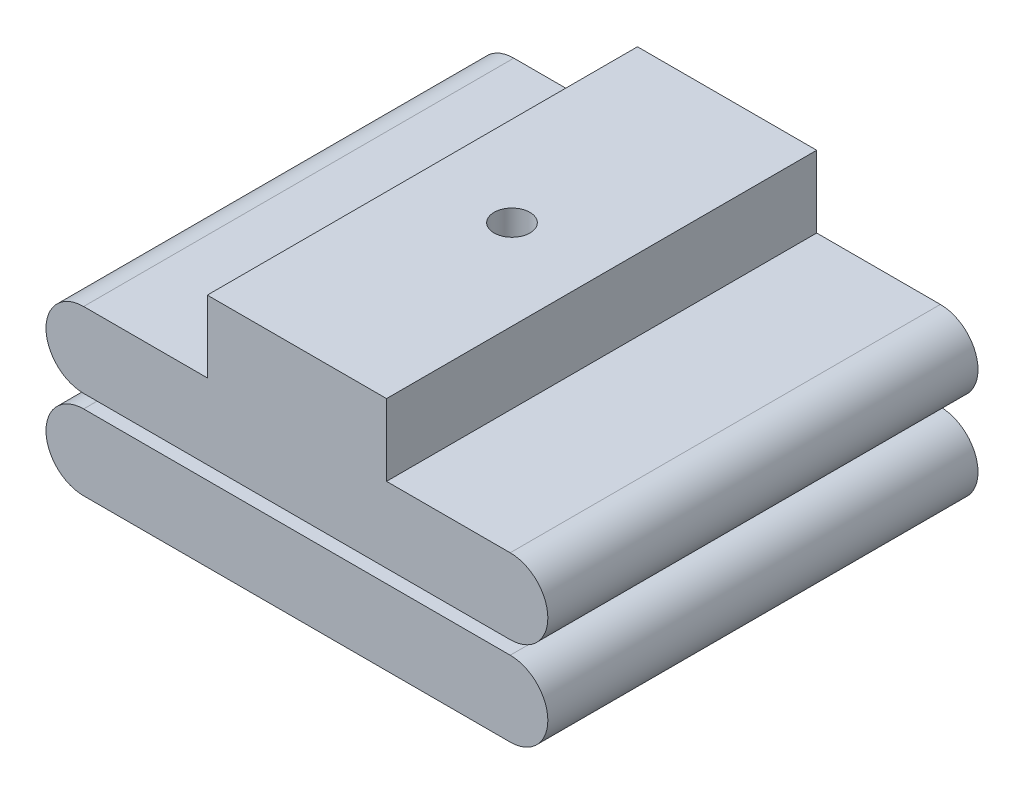
ISO-10303-21;
HEADER;
FILE_DESCRIPTION(('STEP AP214'),'2;1');
FILE_NAME('part.step','',(''),(''),'','','');
FILE_SCHEMA(('AUTOMOTIVE_DESIGN { 1 0 10303 214 1 1 1 1 }'));
ENDSEC;
DATA;
#1=APPLICATION_CONTEXT('core data for automotive mechanical design processes');
#2=APPLICATION_PROTOCOL_DEFINITION('international standard','automotive_design',2000,#1);
#3=PRODUCT_CONTEXT('',#1,'mechanical');
#4=PRODUCT('Part','Part','',(#3));
#5=PRODUCT_RELATED_PRODUCT_CATEGORY('part','',(#4));
#6=PRODUCT_DEFINITION_FORMATION('','',#4);
#7=PRODUCT_DEFINITION_CONTEXT('part definition',#1,'design');
#8=PRODUCT_DEFINITION('design','',#6,#7);
#9=PRODUCT_DEFINITION_SHAPE('','',#8);
#10=(LENGTH_UNIT() NAMED_UNIT(*) SI_UNIT(.MILLI.,.METRE.));
#11=(NAMED_UNIT(*) PLANE_ANGLE_UNIT() SI_UNIT($,.RADIAN.));
#12=(NAMED_UNIT(*) SI_UNIT($,.STERADIAN.) SOLID_ANGLE_UNIT());
#13=UNCERTAINTY_MEASURE_WITH_UNIT(LENGTH_MEASURE(1.E-05),#10,'distance_accuracy_value','');
#14=(GEOMETRIC_REPRESENTATION_CONTEXT(3) GLOBAL_UNCERTAINTY_ASSIGNED_CONTEXT((#13)) GLOBAL_UNIT_ASSIGNED_CONTEXT((#10,
#11,#12)) REPRESENTATION_CONTEXT('',''));
#15=CARTESIAN_POINT('',(0.,0.,0.));
#16=DIRECTION('',(0.,0.,1.));
#17=DIRECTION('',(1.,0.,0.));
#18=AXIS2_PLACEMENT_3D('',#15,#16,#17);
#19=CARTESIAN_POINT('',(11.9,-2.09999999999999,10.));
#20=DIRECTION('',(-1.,0.,0.));
#21=DIRECTION('',(0.,-1.,0.));
#22=AXIS2_PLACEMENT_3D('',#19,#20,#21);
#23=SPHERICAL_SURFACE('',#22,0.5);
#24=CARTESIAN_POINT('',(11.9,-2.1,10.));
#25=DIRECTION('',(-1.,0.,0.));
#26=DIRECTION('',(0.,-1.,0.));
#27=AXIS2_PLACEMENT_3D('',#24,#25,#26);
#28=CIRCLE('',#27,0.499999999999997);
#29=CARTESIAN_POINT('',(11.9,-2.59999999999999,10.));
#30=VERTEX_POINT('',#29);
#31=CARTESIAN_POINT('',(11.9,-1.6,10.));
#32=VERTEX_POINT('',#31);
#33=EDGE_CURVE('E381',#30,#32,#28,.T.);
#34=ORIENTED_EDGE('',*,*,#33,.T.);
#35=CARTESIAN_POINT('',(11.9,-2.1,10.));
#36=DIRECTION('',(0.,0.,1.));
#37=DIRECTION('',(-1.,0.,0.));
#38=AXIS2_PLACEMENT_3D('',#35,#36,#37);
#39=CIRCLE('',#38,0.5);
#40=EDGE_CURVE('E398',#30,#32,#39,.T.);
#41=ORIENTED_EDGE('',*,*,#40,.F.);
#42=EDGE_LOOP('',(#34,#41));
#43=FACE_BOUND('',#42,.T.);
#44=ADVANCED_FACE('F58',(#43),#23,.F.);
#45=CARTESIAN_POINT('',(-12.4,-2.1,10.));
#46=DIRECTION('',(-1.,0.,0.));
#47=DIRECTION('',(0.,-1.,0.));
#48=AXIS2_PLACEMENT_3D('',#45,#46,#47);
#49=CYLINDRICAL_SURFACE('',#48,0.499999999999999);
#50=CARTESIAN_POINT('',(-11.9,-2.1,10.));
#51=DIRECTION('',(-1.,0.,0.));
#52=DIRECTION('',(0.,-1.,0.));
#53=AXIS2_PLACEMENT_3D('',#50,#51,#52);
#54=CIRCLE('',#53,0.5);
#55=CARTESIAN_POINT('',(-11.9,-2.6,10.));
#56=VERTEX_POINT('',#55);
#57=CARTESIAN_POINT('',(-11.9,-1.6,10.));
#58=VERTEX_POINT('',#57);
#59=EDGE_CURVE('E377',#56,#58,#54,.T.);
#60=ORIENTED_EDGE('',*,*,#59,.T.);
#61=DIRECTION('',(-1.,0.,0.));
#62=VECTOR('',#61,1.);
#63=CARTESIAN_POINT('',(-11.9,-1.6,10.));
#64=LINE('',#63,#62);
#65=EDGE_CURVE('E402',#32,#58,#64,.T.);
#66=ORIENTED_EDGE('',*,*,#65,.F.);
#67=ORIENTED_EDGE('',*,*,#33,.F.);
#68=DIRECTION('',(1.,0.,0.));
#69=VECTOR('',#68,1.);
#70=CARTESIAN_POINT('',(-11.9,-2.6,10.));
#71=LINE('',#70,#69);
#72=EDGE_CURVE('E410',#56,#30,#71,.T.);
#73=ORIENTED_EDGE('',*,*,#72,.F.);
#74=EDGE_LOOP('',(#60,#66,#67,#73));
#75=FACE_BOUND('',#74,.T.);
#76=ADVANCED_FACE('F480',(#75),#49,.F.);
#77=CARTESIAN_POINT('',(-11.9,-2.1,10.));
#78=DIRECTION('',(-1.,0.,0.));
#79=DIRECTION('',(0.,-1.,0.));
#80=AXIS2_PLACEMENT_3D('',#77,#78,#79);
#81=SPHERICAL_SURFACE('',#80,0.5);
#82=CARTESIAN_POINT('',(-11.9,-2.1,10.));
#83=DIRECTION('',(0.,0.,1.));
#84=DIRECTION('',(1.,0.,0.));
#85=AXIS2_PLACEMENT_3D('',#82,#83,#84);
#86=CIRCLE('',#85,0.5);
#87=EDGE_CURVE('E406',#58,#56,#86,.T.);
#88=ORIENTED_EDGE('',*,*,#87,.F.);
#89=ORIENTED_EDGE('',*,*,#59,.F.);
#90=EDGE_LOOP('',(#88,#89));
#91=FACE_BOUND('',#90,.T.);
#92=ADVANCED_FACE('F486',(#91),#81,.F.);
#93=CARTESIAN_POINT('',(-11.9,-2.1,10.));
#94=DIRECTION('',(0.,0.,-1.));
#95=DIRECTION('',(-1.,0.,0.));
#96=AXIS2_PLACEMENT_3D('',#93,#94,#95);
#97=CYLINDRICAL_SURFACE('',#96,0.5);
#98=DIRECTION('',(0.,0.,-1.));
#99=VECTOR('',#98,1.);
#100=CARTESIAN_POINT('',(-11.9,-2.6,10.));
#101=LINE('',#100,#99);
#102=CARTESIAN_POINT('',(-11.9,-2.6,-10.));
#103=VERTEX_POINT('',#102);
#104=EDGE_CURVE('E418',#56,#103,#101,.T.);
#105=ORIENTED_EDGE('',*,*,#104,.T.);
#106=CARTESIAN_POINT('',(-11.9,-2.1,-10.));
#107=DIRECTION('',(0.,0.,1.));
#108=DIRECTION('',(1.,0.,0.));
#109=AXIS2_PLACEMENT_3D('',#106,#107,#108);
#110=CIRCLE('',#109,0.5);
#111=CARTESIAN_POINT('',(-11.9,-1.6,-10.));
#112=VERTEX_POINT('',#111);
#113=EDGE_CURVE('E370',#112,#103,#110,.T.);
#114=ORIENTED_EDGE('',*,*,#113,.F.);
#115=DIRECTION('',(0.,0.,-1.));
#116=VECTOR('',#115,1.);
#117=CARTESIAN_POINT('',(-11.9,-1.6,10.));
#118=LINE('',#117,#116);
#119=EDGE_CURVE('E422',#58,#112,#118,.T.);
#120=ORIENTED_EDGE('',*,*,#119,.F.);
#121=ORIENTED_EDGE('',*,*,#87,.T.);
#122=EDGE_LOOP('',(#105,#114,#120,#121));
#123=FACE_BOUND('',#122,.T.);
#124=ADVANCED_FACE('F501',(#123),#97,.F.);
#125=CARTESIAN_POINT('',(-11.9,-1.6,10.));
#126=DIRECTION('',(0.,-1.,0.));
#127=DIRECTION('',(0.,0.,-1.));
#128=AXIS2_PLACEMENT_3D('',#125,#126,#127);
#129=PLANE('',#128);
#130=CARTESIAN_POINT('',(0.,-1.6,0.));
#131=DIRECTION('',(0.,-1.,0.));
#132=DIRECTION('',(0.,0.,-1.));
#133=AXIS2_PLACEMENT_3D('',#130,#131,#132);
#134=CIRCLE('',#133,2.);
#135=CARTESIAN_POINT('',(0.,-1.6,-2.));
#136=VERTEX_POINT('',#135);
#137=EDGE_CURVE('E13',#136,#136,#134,.F.);
#138=ORIENTED_EDGE('',*,*,#137,.T.);
#139=EDGE_LOOP('',(#138));
#140=FACE_BOUND('',#139,.T.);
#141=ORIENTED_EDGE('',*,*,#119,.T.);
#142=DIRECTION('',(-1.,0.,0.));
#143=VECTOR('',#142,1.);
#144=CARTESIAN_POINT('',(-11.9,-1.6,-10.));
#145=LINE('',#144,#143);
#146=CARTESIAN_POINT('',(11.9,-1.6,-10.));
#147=VERTEX_POINT('',#146);
#148=EDGE_CURVE('E374',#147,#112,#145,.T.);
#149=ORIENTED_EDGE('',*,*,#148,.F.);
#150=DIRECTION('',(0.,0.,-1.));
#151=VECTOR('',#150,1.);
#152=CARTESIAN_POINT('',(11.9,-1.6,10.));
#153=LINE('',#152,#151);
#154=EDGE_CURVE('E426',#32,#147,#153,.T.);
#155=ORIENTED_EDGE('',*,*,#154,.F.);
#156=ORIENTED_EDGE('',*,*,#65,.T.);
#157=EDGE_LOOP('',(#141,#149,#155,#156));
#158=FACE_BOUND('',#157,.T.);
#159=ADVANCED_FACE('F504',(#140,#158),#129,.T.);
#160=CARTESIAN_POINT('',(11.9,-2.1,10.));
#161=DIRECTION('',(0.,0.,-1.));
#162=DIRECTION('',(-1.,0.,0.));
#163=AXIS2_PLACEMENT_3D('',#160,#161,#162);
#164=CYLINDRICAL_SURFACE('',#163,0.5);
#165=ORIENTED_EDGE('',*,*,#154,.T.);
#166=CARTESIAN_POINT('',(11.9,-2.1,-10.));
#167=DIRECTION('',(0.,0.,1.));
#168=DIRECTION('',(-1.,0.,0.));
#169=AXIS2_PLACEMENT_3D('',#166,#167,#168);
#170=CIRCLE('',#169,0.5);
#171=CARTESIAN_POINT('',(11.9,-2.59999999999999,-10.));
#172=VERTEX_POINT('',#171);
#173=EDGE_CURVE('E364',#172,#147,#170,.T.);
#174=ORIENTED_EDGE('',*,*,#173,.F.);
#175=DIRECTION('',(0.,0.,-1.));
#176=VECTOR('',#175,1.);
#177=CARTESIAN_POINT('',(11.9,-2.6,10.));
#178=LINE('',#177,#176);
#179=EDGE_CURVE('E414',#30,#172,#178,.T.);
#180=ORIENTED_EDGE('',*,*,#179,.F.);
#181=ORIENTED_EDGE('',*,*,#40,.T.);
#182=EDGE_LOOP('',(#165,#174,#180,#181));
#183=FACE_BOUND('',#182,.T.);
#184=ADVANCED_FACE('F499',(#183),#164,.F.);
#185=CARTESIAN_POINT('',(-11.9,-2.6,10.));
#186=DIRECTION('',(0.,1.,0.));
#187=DIRECTION('',(0.,0.,1.));
#188=AXIS2_PLACEMENT_3D('',#185,#186,#187);
#189=PLANE('',#188);
#190=CARTESIAN_POINT('',(0.,-2.6,0.));
#191=DIRECTION('',(0.,1.,0.));
#192=DIRECTION('',(0.,0.,1.));
#193=AXIS2_PLACEMENT_3D('',#190,#191,#192);
#194=CIRCLE('',#193,2.00000000000015);
#195=CARTESIAN_POINT('',(0.,-2.6,2.00000000000015));
#196=VERTEX_POINT('',#195);
#197=EDGE_CURVE('E459',#196,#196,#194,.F.);
#198=ORIENTED_EDGE('',*,*,#197,.T.);
#199=EDGE_LOOP('',(#198));
#200=FACE_BOUND('',#199,.T.);
#201=ORIENTED_EDGE('',*,*,#179,.T.);
#202=DIRECTION('',(1.,0.,0.));
#203=VECTOR('',#202,1.);
#204=CARTESIAN_POINT('',(-11.9,-2.6,-10.));
#205=LINE('',#204,#203);
#206=EDGE_CURVE('E367',#103,#172,#205,.T.);
#207=ORIENTED_EDGE('',*,*,#206,.F.);
#208=ORIENTED_EDGE('',*,*,#104,.F.);
#209=ORIENTED_EDGE('',*,*,#72,.T.);
#210=EDGE_LOOP('',(#201,#207,#208,#209));
#211=FACE_BOUND('',#210,.T.);
#212=ADVANCED_FACE('F495',(#200,#211),#189,.T.);
#213=CARTESIAN_POINT('',(11.9,-2.09999999999999,-10.));
#214=DIRECTION('',(-1.,0.,0.));
#215=DIRECTION('',(0.,-1.,0.));
#216=AXIS2_PLACEMENT_3D('',#213,#214,#215);
#217=SPHERICAL_SURFACE('',#216,0.5);
#218=CARTESIAN_POINT('',(11.9,-2.1,-10.));
#219=DIRECTION('',(1.,0.,0.));
#220=DIRECTION('',(0.,-1.,0.));
#221=AXIS2_PLACEMENT_3D('',#218,#219,#220);
#222=CIRCLE('',#221,0.499999999999997);
#223=EDGE_CURVE('E344',#172,#147,#222,.T.);
#224=ORIENTED_EDGE('',*,*,#223,.F.);
#225=ORIENTED_EDGE('',*,*,#173,.T.);
#226=EDGE_LOOP('',(#224,#225));
#227=FACE_BOUND('',#226,.T.);
#228=ADVANCED_FACE('F498',(#227),#217,.F.);
#229=CARTESIAN_POINT('',(-12.4,-2.1,-10.));
#230=DIRECTION('',(-1.,0.,0.));
#231=DIRECTION('',(0.,-1.,0.));
#232=AXIS2_PLACEMENT_3D('',#229,#230,#231);
#233=CYLINDRICAL_SURFACE('',#232,0.499999999999999);
#234=CARTESIAN_POINT('',(-11.9,-2.1,-10.));
#235=DIRECTION('',(1.,0.,0.));
#236=DIRECTION('',(0.,-1.,0.));
#237=AXIS2_PLACEMENT_3D('',#234,#235,#236);
#238=CIRCLE('',#237,0.5);
#239=EDGE_CURVE('E340',#103,#112,#238,.T.);
#240=ORIENTED_EDGE('',*,*,#239,.F.);
#241=ORIENTED_EDGE('',*,*,#206,.T.);
#242=ORIENTED_EDGE('',*,*,#223,.T.);
#243=ORIENTED_EDGE('',*,*,#148,.T.);
#244=EDGE_LOOP('',(#240,#241,#242,#243));
#245=FACE_BOUND('',#244,.T.);
#246=ADVANCED_FACE('F557',(#245),#233,.F.);
#247=CARTESIAN_POINT('',(-11.9,-2.1,-10.));
#248=DIRECTION('',(-1.,0.,0.));
#249=DIRECTION('',(0.,-1.,0.));
#250=AXIS2_PLACEMENT_3D('',#247,#248,#249);
#251=SPHERICAL_SURFACE('',#250,0.5);
#252=ORIENTED_EDGE('',*,*,#113,.T.);
#253=ORIENTED_EDGE('',*,*,#239,.T.);
#254=EDGE_LOOP('',(#252,#253));
#255=FACE_BOUND('',#254,.T.);
#256=ADVANCED_FACE('F550',(#255),#251,.F.);
#257=CARTESIAN_POINT('',(0.,-10.3784271247462,0.));
#258=DIRECTION('',(0.,1.,0.));
#259=DIRECTION('',(-1.,0.,0.));
#260=AXIS2_PLACEMENT_3D('',#257,#258,#259);
#261=CYLINDRICAL_SURFACE('',#260,1.);
#262=CARTESIAN_POINT('',(0.,-0.600000000000002,0.));
#263=DIRECTION('',(0.,-1.,0.));
#264=DIRECTION('',(0.,0.,-1.));
#265=AXIS2_PLACEMENT_3D('',#262,#263,#264);
#266=CIRCLE('',#265,1.);
#267=CARTESIAN_POINT('',(-1.,-0.6,0.));
#268=VERTEX_POINT('',#267);
#269=EDGE_CURVE('E67',#268,#268,#266,.T.);
#270=CARTESIAN_POINT('',(0.,4.,0.));
#271=DIRECTION('',(0.,1.,0.));
#272=DIRECTION('',(-1.,0.,0.));
#273=AXIS2_PLACEMENT_3D('',#270,#271,#272);
#274=CIRCLE('',#273,1.);
#275=CARTESIAN_POINT('',(-1.,4.,0.));
#276=VERTEX_POINT('',#275);
#277=EDGE_CURVE('E1101',#276,#276,#274,.T.);
#278=CARTESIAN_POINT('',(-1.,-0.6,0.));
#279=CARTESIAN_POINT('',(-1.,-0.552083333333333,0.));
#280=CARTESIAN_POINT('',(-1.,-0.504166666666667,0.));
#281=CARTESIAN_POINT('',(-1.,-0.408333333333333,0.));
#282=CARTESIAN_POINT('',(-1.,-0.360416666666667,0.));
#283=CARTESIAN_POINT('',(-1.,-0.264583333333334,0.));
#284=CARTESIAN_POINT('',(-1.,-0.216666666666667,0.));
#285=CARTESIAN_POINT('',(-1.,-0.120833333333334,0.));
#286=CARTESIAN_POINT('',(-1.,-0.0729166666666673,0.));
#287=CARTESIAN_POINT('',(-1.,0.0229166666666665,0.));
#288=CARTESIAN_POINT('',(-1.,0.0708333333333336,0.));
#289=CARTESIAN_POINT('',(-1.,0.166666666666667,0.));
#290=CARTESIAN_POINT('',(-1.,0.214583333333334,0.));
#291=CARTESIAN_POINT('',(-1.,0.310416666666667,0.));
#292=CARTESIAN_POINT('',(-1.,0.358333333333334,0.));
#293=CARTESIAN_POINT('',(-1.,0.454166666666667,0.));
#294=CARTESIAN_POINT('',(-1.,0.502083333333334,0.));
#295=CARTESIAN_POINT('',(-1.,0.597916666666667,0.));
#296=CARTESIAN_POINT('',(-1.,0.645833333333333,0.));
#297=CARTESIAN_POINT('',(-1.,0.741666666666666,0.));
#298=CARTESIAN_POINT('',(-1.,0.789583333333333,0.));
#299=CARTESIAN_POINT('',(-1.,0.885416666666666,0.));
#300=CARTESIAN_POINT('',(-1.,0.933333333333333,0.));
#301=CARTESIAN_POINT('',(-1.,1.02916666666667,0.));
#302=CARTESIAN_POINT('',(-1.,1.07708333333333,0.));
#303=CARTESIAN_POINT('',(-1.,1.17291666666667,0.));
#304=CARTESIAN_POINT('',(-1.,1.22083333333333,0.));
#305=CARTESIAN_POINT('',(-1.,1.31666666666667,0.));
#306=CARTESIAN_POINT('',(-1.,1.36458333333333,0.));
#307=CARTESIAN_POINT('',(-1.,1.46041666666667,0.));
#308=CARTESIAN_POINT('',(-1.,1.50833333333333,0.));
#309=CARTESIAN_POINT('',(-1.,1.60416666666667,0.));
#310=CARTESIAN_POINT('',(-1.,1.65208333333333,0.));
#311=CARTESIAN_POINT('',(-1.,1.74791666666667,0.));
#312=CARTESIAN_POINT('',(-1.,1.79583333333333,0.));
#313=CARTESIAN_POINT('',(-1.,1.89166666666667,0.));
#314=CARTESIAN_POINT('',(-1.,1.93958333333333,0.));
#315=CARTESIAN_POINT('',(-1.,2.03541666666667,0.));
#316=CARTESIAN_POINT('',(-1.,2.08333333333333,0.));
#317=CARTESIAN_POINT('',(-1.,2.17916666666667,0.));
#318=CARTESIAN_POINT('',(-1.,2.22708333333333,0.));
#319=CARTESIAN_POINT('',(-1.,2.32291666666667,0.));
#320=CARTESIAN_POINT('',(-1.,2.37083333333333,0.));
#321=CARTESIAN_POINT('',(-1.,2.46666666666667,0.));
#322=CARTESIAN_POINT('',(-1.,2.51458333333333,0.));
#323=CARTESIAN_POINT('',(-1.,2.61041666666667,0.));
#324=CARTESIAN_POINT('',(-1.,2.65833333333333,0.));
#325=CARTESIAN_POINT('',(-1.,2.75416666666667,0.));
#326=CARTESIAN_POINT('',(-1.,2.80208333333333,0.));
#327=CARTESIAN_POINT('',(-1.,2.89791666666667,0.));
#328=CARTESIAN_POINT('',(-1.,2.94583333333333,0.));
#329=CARTESIAN_POINT('',(-1.,3.04166666666667,0.));
#330=CARTESIAN_POINT('',(-1.,3.08958333333333,0.));
#331=CARTESIAN_POINT('',(-1.,3.18541666666667,0.));
#332=CARTESIAN_POINT('',(-1.,3.23333333333333,0.));
#333=CARTESIAN_POINT('',(-1.,3.32916666666667,0.));
#334=CARTESIAN_POINT('',(-1.,3.37708333333333,0.));
#335=CARTESIAN_POINT('',(-1.,3.47291666666667,0.));
#336=CARTESIAN_POINT('',(-1.,3.52083333333333,0.));
#337=CARTESIAN_POINT('',(-1.,3.61666666666667,0.));
#338=CARTESIAN_POINT('',(-1.,3.66458333333333,0.));
#339=CARTESIAN_POINT('',(-1.,3.76041666666667,0.));
#340=CARTESIAN_POINT('',(-1.,3.80833333333333,0.));
#341=CARTESIAN_POINT('',(-1.,3.90416666666667,0.));
#342=CARTESIAN_POINT('',(-1.,3.95208333333333,0.));
#343=CARTESIAN_POINT('',(-1.,4.,0.));
#344=B_SPLINE_CURVE_WITH_KNOTS('',3,(#278,#279,#280,#281,#282,#283,#284,#285,#286,#287,#288,
#289,#290,#291,#292,#293,#294,#295,#296,#297,#298,#299,#300,#301,#302,#303,#304,#305,#306,#307,
#308,#309,#310,#311,#312,#313,#314,#315,#316,#317,#318,#319,#320,#321,#322,#323,#324,#325,#326,
#327,#328,#329,#330,#331,#332,#333,#334,#335,#336,#337,#338,#339,#340,#341,#342,#343),
.UNSPECIFIED.,.F.,.F.,(4,2,2,2,2,2,2,2,2,2,2,2,2,2,2,2,2,2,2,2,2,2,2,2,2,2,2,2,2,2,2,2,4),(0.,
0.14375,0.2875,0.431249999999999,0.574999999999999,0.718750000000001,0.8625,1.00625,1.15,
1.29375,1.4375,1.58125,1.725,1.86875,2.0125,2.15625,2.3,2.44375,2.5875,2.73125,2.875,3.01875,
3.1625,3.30625,3.45,3.59375,3.7375,3.88125,4.025,4.16875,4.3125,4.45625,4.6),.UNSPECIFIED.);
#345=EDGE_CURVE('BSEAM467',#268,#276,#344,.T.);
#346=ORIENTED_EDGE('',*,*,#269,.T.);
#347=ORIENTED_EDGE('',*,*,#277,.T.);
#348=ORIENTED_EDGE('',*,*,#345,.T.);
#349=ORIENTED_EDGE('',*,*,#345,.F.);
#350=EDGE_LOOP('',(#346,#348,#347,#349));
#351=FACE_BOUND('',#350,.T.);
#352=ADVANCED_FACE('F467',(#351),#261,.F.);
#353=CARTESIAN_POINT('',(0.,0.,0.));
#354=DIRECTION('',(0.,1.,0.));
#355=DIRECTION('',(0.,0.,1.));
#356=AXIS2_PLACEMENT_3D('',#353,#354,#355);
#357=CYLINDRICAL_SURFACE('',#356,1.00000000000015);
#358=CARTESIAN_POINT('',(0.,-5.55,0.));
#359=DIRECTION('',(0.,-1.,0.));
#360=DIRECTION('',(0.,0.,-1.));
#361=AXIS2_PLACEMENT_3D('',#358,#359,#360);
#362=CIRCLE('',#361,1.00000000000015);
#363=CARTESIAN_POINT('',(0.,-5.55,-1.00000000000015));
#364=VERTEX_POINT('',#363);
#365=EDGE_CURVE('E451',#364,#364,#362,.T.);
#366=ORIENTED_EDGE('',*,*,#365,.T.);
#367=EDGE_LOOP('',(#366));
#368=FACE_BOUND('',#367,.T.);
#369=CARTESIAN_POINT('',(0.,-3.6,0.));
#370=DIRECTION('',(0.,1.,0.));
#371=DIRECTION('',(0.,0.,1.));
#372=AXIS2_PLACEMENT_3D('',#369,#370,#371);
#373=CIRCLE('',#372,1.00000000000015);
#374=CARTESIAN_POINT('',(0.,-3.6,1.00000000000015));
#375=VERTEX_POINT('',#374);
#376=EDGE_CURVE('E447',#375,#375,#373,.T.);
#377=ORIENTED_EDGE('',*,*,#376,.T.);
#378=EDGE_LOOP('',(#377));
#379=FACE_BOUND('',#378,.T.);
#380=ADVANCED_FACE('F536',(#368,#379),#357,.F.);
#381=CARTESIAN_POINT('',(11.9,-7.04999999999999,10.));
#382=DIRECTION('',(-1.,0.,0.));
#383=DIRECTION('',(0.,-1.,0.));
#384=AXIS2_PLACEMENT_3D('',#381,#382,#383);
#385=SPHERICAL_SURFACE('',#384,0.5);
#386=CARTESIAN_POINT('',(11.9,-7.05,10.));
#387=DIRECTION('',(-1.,0.,0.));
#388=DIRECTION('',(0.,-1.,0.));
#389=AXIS2_PLACEMENT_3D('',#386,#387,#388);
#390=CIRCLE('',#389,0.499999999999997);
#391=CARTESIAN_POINT('',(11.9,-7.55,10.));
#392=VERTEX_POINT('',#391);
#393=CARTESIAN_POINT('',(11.9,-6.55,10.));
#394=VERTEX_POINT('',#393);
#395=EDGE_CURVE('E273',#392,#394,#390,.T.);
#396=ORIENTED_EDGE('',*,*,#395,.T.);
#397=CARTESIAN_POINT('',(11.9,-7.05,10.));
#398=DIRECTION('',(0.,0.,1.));
#399=DIRECTION('',(-1.,0.,0.));
#400=AXIS2_PLACEMENT_3D('',#397,#398,#399);
#401=CIRCLE('',#400,0.5);
#402=EDGE_CURVE('E292',#392,#394,#401,.T.);
#403=ORIENTED_EDGE('',*,*,#402,.F.);
#404=EDGE_LOOP('',(#396,#403));
#405=FACE_BOUND('',#404,.T.);
#406=ADVANCED_FACE('F539',(#405),#385,.F.);
#407=CARTESIAN_POINT('',(-12.4,-7.05,10.));
#408=DIRECTION('',(-1.,0.,0.));
#409=DIRECTION('',(0.,-1.,0.));
#410=AXIS2_PLACEMENT_3D('',#407,#408,#409);
#411=CYLINDRICAL_SURFACE('',#410,0.499999999999999);
#412=CARTESIAN_POINT('',(-11.9,-7.05,10.));
#413=DIRECTION('',(-1.,0.,0.));
#414=DIRECTION('',(0.,-1.,0.));
#415=AXIS2_PLACEMENT_3D('',#412,#413,#414);
#416=CIRCLE('',#415,0.5);
#417=CARTESIAN_POINT('',(-11.9,-7.55,10.));
#418=VERTEX_POINT('',#417);
#419=CARTESIAN_POINT('',(-11.9,-6.55,10.));
#420=VERTEX_POINT('',#419);
#421=EDGE_CURVE('E269',#418,#420,#416,.T.);
#422=ORIENTED_EDGE('',*,*,#421,.T.);
#423=DIRECTION('',(-1.,0.,0.));
#424=VECTOR('',#423,1.);
#425=CARTESIAN_POINT('',(-11.9,-6.55,10.));
#426=LINE('',#425,#424);
#427=EDGE_CURVE('E296',#394,#420,#426,.T.);
#428=ORIENTED_EDGE('',*,*,#427,.F.);
#429=ORIENTED_EDGE('',*,*,#395,.F.);
#430=DIRECTION('',(1.,0.,0.));
#431=VECTOR('',#430,1.);
#432=CARTESIAN_POINT('',(-11.9,-7.55,10.));
#433=LINE('',#432,#431);
#434=EDGE_CURVE('E304',#418,#392,#433,.T.);
#435=ORIENTED_EDGE('',*,*,#434,.F.);
#436=EDGE_LOOP('',(#422,#428,#429,#435));
#437=FACE_BOUND('',#436,.T.);
#438=ADVANCED_FACE('F547',(#437),#411,.F.);
#439=CARTESIAN_POINT('',(-11.9,-7.05,10.));
#440=DIRECTION('',(-1.,0.,0.));
#441=DIRECTION('',(0.,-1.,0.));
#442=AXIS2_PLACEMENT_3D('',#439,#440,#441);
#443=SPHERICAL_SURFACE('',#442,0.5);
#444=CARTESIAN_POINT('',(-11.9,-7.05,10.));
#445=DIRECTION('',(0.,0.,1.));
#446=DIRECTION('',(1.,0.,0.));
#447=AXIS2_PLACEMENT_3D('',#444,#445,#446);
#448=CIRCLE('',#447,0.5);
#449=EDGE_CURVE('E300',#420,#418,#448,.T.);
#450=ORIENTED_EDGE('',*,*,#449,.F.);
#451=ORIENTED_EDGE('',*,*,#421,.F.);
#452=EDGE_LOOP('',(#450,#451));
#453=FACE_BOUND('',#452,.T.);
#454=ADVANCED_FACE('F768',(#453),#443,.F.);
#455=CARTESIAN_POINT('',(-11.9,-7.05,10.));
#456=DIRECTION('',(0.,0.,-1.));
#457=DIRECTION('',(-1.,0.,0.));
#458=AXIS2_PLACEMENT_3D('',#455,#456,#457);
#459=CYLINDRICAL_SURFACE('',#458,0.5);
#460=DIRECTION('',(0.,0.,-1.));
#461=VECTOR('',#460,1.);
#462=CARTESIAN_POINT('',(-11.9,-7.55,10.));
#463=LINE('',#462,#461);
#464=CARTESIAN_POINT('',(-11.9,-7.55,-10.));
#465=VERTEX_POINT('',#464);
#466=EDGE_CURVE('E312',#418,#465,#463,.T.);
#467=ORIENTED_EDGE('',*,*,#466,.T.);
#468=CARTESIAN_POINT('',(-11.9,-7.05,-10.));
#469=DIRECTION('',(0.,0.,1.));
#470=DIRECTION('',(1.,0.,0.));
#471=AXIS2_PLACEMENT_3D('',#468,#469,#470);
#472=CIRCLE('',#471,0.5);
#473=CARTESIAN_POINT('',(-11.9,-6.55,-10.));
#474=VERTEX_POINT('',#473);
#475=EDGE_CURVE('E262',#474,#465,#472,.T.);
#476=ORIENTED_EDGE('',*,*,#475,.F.);
#477=DIRECTION('',(0.,0.,-1.));
#478=VECTOR('',#477,1.);
#479=CARTESIAN_POINT('',(-11.9,-6.55,10.));
#480=LINE('',#479,#478);
#481=EDGE_CURVE('E316',#420,#474,#480,.T.);
#482=ORIENTED_EDGE('',*,*,#481,.F.);
#483=ORIENTED_EDGE('',*,*,#449,.T.);
#484=EDGE_LOOP('',(#467,#476,#482,#483));
#485=FACE_BOUND('',#484,.T.);
#486=ADVANCED_FACE('F642',(#485),#459,.F.);
#487=CARTESIAN_POINT('',(-11.9,-6.55,10.));
#488=DIRECTION('',(0.,-1.,0.));
#489=DIRECTION('',(0.,0.,-1.));
#490=AXIS2_PLACEMENT_3D('',#487,#488,#489);
#491=PLANE('',#490);
#492=CARTESIAN_POINT('',(0.,-6.55,0.));
#493=DIRECTION('',(0.,-1.,0.));
#494=DIRECTION('',(0.,0.,-1.));
#495=AXIS2_PLACEMENT_3D('',#492,#493,#494);
#496=CIRCLE('',#495,2.00000000000015);
#497=CARTESIAN_POINT('',(0.,-6.55,-2.00000000000015));
#498=VERTEX_POINT('',#497);
#499=EDGE_CURVE('E455',#498,#498,#496,.F.);
#500=ORIENTED_EDGE('',*,*,#499,.T.);
#501=EDGE_LOOP('',(#500));
#502=FACE_BOUND('',#501,.T.);
#503=ORIENTED_EDGE('',*,*,#481,.T.);
#504=DIRECTION('',(-1.,0.,0.));
#505=VECTOR('',#504,1.);
#506=CARTESIAN_POINT('',(-11.9,-6.55,-10.));
#507=LINE('',#506,#505);
#508=CARTESIAN_POINT('',(11.9,-6.55,-10.));
#509=VERTEX_POINT('',#508);
#510=EDGE_CURVE('E266',#509,#474,#507,.T.);
#511=ORIENTED_EDGE('',*,*,#510,.F.);
#512=DIRECTION('',(0.,0.,-1.));
#513=VECTOR('',#512,1.);
#514=CARTESIAN_POINT('',(11.9,-6.55,10.));
#515=LINE('',#514,#513);
#516=EDGE_CURVE('E320',#394,#509,#515,.T.);
#517=ORIENTED_EDGE('',*,*,#516,.F.);
#518=ORIENTED_EDGE('',*,*,#427,.T.);
#519=EDGE_LOOP('',(#503,#511,#517,#518));
#520=FACE_BOUND('',#519,.T.);
#521=ADVANCED_FACE('F637',(#502,#520),#491,.T.);
#522=CARTESIAN_POINT('',(11.9,-7.05,10.));
#523=DIRECTION('',(0.,0.,-1.));
#524=DIRECTION('',(-1.,0.,0.));
#525=AXIS2_PLACEMENT_3D('',#522,#523,#524);
#526=CYLINDRICAL_SURFACE('',#525,0.5);
#527=ORIENTED_EDGE('',*,*,#516,.T.);
#528=CARTESIAN_POINT('',(11.9,-7.05,-10.));
#529=DIRECTION('',(0.,0.,1.));
#530=DIRECTION('',(-1.,0.,0.));
#531=AXIS2_PLACEMENT_3D('',#528,#529,#530);
#532=CIRCLE('',#531,0.5);
#533=CARTESIAN_POINT('',(11.9,-7.55,-10.));
#534=VERTEX_POINT('',#533);
#535=EDGE_CURVE('E256',#534,#509,#532,.T.);
#536=ORIENTED_EDGE('',*,*,#535,.F.);
#537=DIRECTION('',(0.,0.,-1.));
#538=VECTOR('',#537,1.);
#539=CARTESIAN_POINT('',(11.9,-7.55,10.));
#540=LINE('',#539,#538);
#541=EDGE_CURVE('E308',#392,#534,#540,.T.);
#542=ORIENTED_EDGE('',*,*,#541,.F.);
#543=ORIENTED_EDGE('',*,*,#402,.T.);
#544=EDGE_LOOP('',(#527,#536,#542,#543));
#545=FACE_BOUND('',#544,.T.);
#546=ADVANCED_FACE('F641',(#545),#526,.F.);
#547=CARTESIAN_POINT('',(-11.9,-7.55,10.));
#548=DIRECTION('',(0.,1.,0.));
#549=DIRECTION('',(0.,0.,1.));
#550=AXIS2_PLACEMENT_3D('',#547,#548,#549);
#551=PLANE('',#550);
#552=ORIENTED_EDGE('',*,*,#541,.T.);
#553=DIRECTION('',(1.,0.,0.));
#554=VECTOR('',#553,1.);
#555=CARTESIAN_POINT('',(-11.9,-7.55,-10.));
#556=LINE('',#555,#554);
#557=EDGE_CURVE('E259',#465,#534,#556,.T.);
#558=ORIENTED_EDGE('',*,*,#557,.F.);
#559=ORIENTED_EDGE('',*,*,#466,.F.);
#560=ORIENTED_EDGE('',*,*,#434,.T.);
#561=EDGE_LOOP('',(#552,#558,#559,#560));
#562=FACE_BOUND('',#561,.T.);
#563=ADVANCED_FACE('F714',(#562),#551,.T.);
#564=CARTESIAN_POINT('',(11.9,-7.04999999999999,-10.));
#565=DIRECTION('',(-1.,0.,0.));
#566=DIRECTION('',(0.,-1.,0.));
#567=AXIS2_PLACEMENT_3D('',#564,#565,#566);
#568=SPHERICAL_SURFACE('',#567,0.5);
#569=CARTESIAN_POINT('',(11.9,-7.05,-10.));
#570=DIRECTION('',(1.,0.,0.));
#571=DIRECTION('',(0.,-1.,0.));
#572=AXIS2_PLACEMENT_3D('',#569,#570,#571);
#573=CIRCLE('',#572,0.499999999999997);
#574=EDGE_CURVE('E231',#534,#509,#573,.T.);
#575=ORIENTED_EDGE('',*,*,#574,.F.);
#576=ORIENTED_EDGE('',*,*,#535,.T.);
#577=EDGE_LOOP('',(#575,#576));
#578=FACE_BOUND('',#577,.T.);
#579=ADVANCED_FACE('F719',(#578),#568,.F.);
#580=CARTESIAN_POINT('',(-12.4,-7.05,-10.));
#581=DIRECTION('',(-1.,0.,0.));
#582=DIRECTION('',(0.,-1.,0.));
#583=AXIS2_PLACEMENT_3D('',#580,#581,#582);
#584=CYLINDRICAL_SURFACE('',#583,0.499999999999999);
#585=CARTESIAN_POINT('',(-11.9,-7.05,-10.));
#586=DIRECTION('',(1.,0.,0.));
#587=DIRECTION('',(0.,-1.,0.));
#588=AXIS2_PLACEMENT_3D('',#585,#586,#587);
#589=CIRCLE('',#588,0.5);
#590=EDGE_CURVE('E225',#465,#474,#589,.T.);
#591=ORIENTED_EDGE('',*,*,#590,.F.);
#592=ORIENTED_EDGE('',*,*,#557,.T.);
#593=ORIENTED_EDGE('',*,*,#574,.T.);
#594=ORIENTED_EDGE('',*,*,#510,.T.);
#595=EDGE_LOOP('',(#591,#592,#593,#594));
#596=FACE_BOUND('',#595,.T.);
#597=ADVANCED_FACE('F731',(#596),#584,.F.);
#598=CARTESIAN_POINT('',(-11.9,-7.05,-10.));
#599=DIRECTION('',(-1.,0.,0.));
#600=DIRECTION('',(0.,-1.,0.));
#601=AXIS2_PLACEMENT_3D('',#598,#599,#600);
#602=SPHERICAL_SURFACE('',#601,0.5);
#603=ORIENTED_EDGE('',*,*,#475,.T.);
#604=ORIENTED_EDGE('',*,*,#590,.T.);
#605=EDGE_LOOP('',(#603,#604));
#606=FACE_BOUND('',#605,.T.);
#607=ADVANCED_FACE('F708',(#606),#602,.F.);
#608=CARTESIAN_POINT('',(0.,4.,0.));
#609=DIRECTION('',(0.,1.,0.));
#610=DIRECTION('',(-1.,0.,0.));
#611=AXIS2_PLACEMENT_3D('',#608,#609,#610);
#612=PLANE('',#611);
#613=DIRECTION('',(0.,0.,1.));
#614=VECTOR('',#613,1.);
#615=CARTESIAN_POINT('',(-5.,4.,-12.));
#616=LINE('',#615,#614);
#617=CARTESIAN_POINT('',(-5.,4.,-12.));
#618=VERTEX_POINT('',#617);
#619=CARTESIAN_POINT('',(-5.,4.,12.));
#620=VERTEX_POINT('',#619);
#621=EDGE_CURVE('E210',#618,#620,#616,.T.);
#622=ORIENTED_EDGE('',*,*,#621,.T.);
#623=DIRECTION('',(1.,0.,0.));
#624=VECTOR('',#623,1.);
#625=CARTESIAN_POINT('',(-5.,4.,12.));
#626=LINE('',#625,#624);
#627=CARTESIAN_POINT('',(5.,4.,12.));
#628=VERTEX_POINT('',#627);
#629=EDGE_CURVE('E197',#620,#628,#626,.T.);
#630=ORIENTED_EDGE('',*,*,#629,.T.);
#631=DIRECTION('',(0.,0.,-1.));
#632=VECTOR('',#631,1.);
#633=CARTESIAN_POINT('',(5.,4.,-12.));
#634=LINE('',#633,#632);
#635=CARTESIAN_POINT('',(5.,4.,-12.));
#636=VERTEX_POINT('',#635);
#637=EDGE_CURVE('E209',#628,#636,#634,.T.);
#638=ORIENTED_EDGE('',*,*,#637,.T.);
#639=DIRECTION('',(-1.,0.,0.));
#640=VECTOR('',#639,1.);
#641=CARTESIAN_POINT('',(-5.,4.,-12.));
#642=LINE('',#641,#640);
#643=EDGE_CURVE('E216',#636,#618,#642,.T.);
#644=ORIENTED_EDGE('',*,*,#643,.T.);
#645=EDGE_LOOP('',(#622,#630,#638,#644));
#646=FACE_BOUND('',#645,.T.);
#647=ORIENTED_EDGE('',*,*,#277,.F.);
#648=EDGE_LOOP('',(#647));
#649=FACE_BOUND('',#648,.T.);
#650=ADVANCED_FACE('F213',(#646,#649),#612,.T.);
#651=CARTESIAN_POINT('',(-5.,4.,-12.));
#652=DIRECTION('',(1.,0.,0.));
#653=DIRECTION('',(0.,1.,0.));
#654=AXIS2_PLACEMENT_3D('',#651,#652,#653);
#655=PLANE('',#654);
#656=DIRECTION('',(0.,0.,1.));
#657=VECTOR('',#656,1.);
#658=CARTESIAN_POINT('',(-5.,0.,-12.));
#659=LINE('',#658,#657);
#660=CARTESIAN_POINT('',(-5.,0.,-12.));
#661=VERTEX_POINT('',#660);
#662=CARTESIAN_POINT('',(-4.99999999999999,0.,12.));
#663=VERTEX_POINT('',#662);
#664=EDGE_CURVE('E223',#661,#663,#659,.T.);
#665=ORIENTED_EDGE('',*,*,#664,.T.);
#666=DIRECTION('',(0.,-1.,0.));
#667=VECTOR('',#666,1.);
#668=CARTESIAN_POINT('',(-5.,4.,12.));
#669=LINE('',#668,#667);
#670=EDGE_CURVE('E202',#620,#663,#669,.T.);
#671=ORIENTED_EDGE('',*,*,#670,.F.);
#672=ORIENTED_EDGE('',*,*,#621,.F.);
#673=DIRECTION('',(0.,-1.,0.));
#674=VECTOR('',#673,1.);
#675=CARTESIAN_POINT('',(-5.,4.,-12.));
#676=LINE('',#675,#674);
#677=EDGE_CURVE('E1077',#618,#661,#676,.T.);
#678=ORIENTED_EDGE('',*,*,#677,.T.);
#679=EDGE_LOOP('',(#665,#671,#672,#678));
#680=FACE_BOUND('',#679,.T.);
#681=ADVANCED_FACE('F222',(#680),#655,.F.);
#682=CARTESIAN_POINT('',(5.,4.,-12.));
#683=DIRECTION('',(-1.,0.,0.));
#684=DIRECTION('',(0.,-1.,0.));
#685=AXIS2_PLACEMENT_3D('',#682,#683,#684);
#686=PLANE('',#685);
#687=DIRECTION('',(0.,0.,-1.));
#688=VECTOR('',#687,1.);
#689=CARTESIAN_POINT('',(5.,0.,-12.));
#690=LINE('',#689,#688);
#691=CARTESIAN_POINT('',(5.,0.,12.));
#692=VERTEX_POINT('',#691);
#693=CARTESIAN_POINT('',(5.,0.,-12.));
#694=VERTEX_POINT('',#693);
#695=EDGE_CURVE('E82',#692,#694,#690,.T.);
#696=ORIENTED_EDGE('',*,*,#695,.T.);
#697=DIRECTION('',(0.,-1.,0.));
#698=VECTOR('',#697,1.);
#699=CARTESIAN_POINT('',(5.,4.,-12.));
#700=LINE('',#699,#698);
#701=EDGE_CURVE('E233',#636,#694,#700,.T.);
#702=ORIENTED_EDGE('',*,*,#701,.F.);
#703=ORIENTED_EDGE('',*,*,#637,.F.);
#704=DIRECTION('',(0.,-1.,0.));
#705=VECTOR('',#704,1.);
#706=CARTESIAN_POINT('',(5.,4.,12.));
#707=LINE('',#706,#705);
#708=EDGE_CURVE('E205',#628,#692,#707,.T.);
#709=ORIENTED_EDGE('',*,*,#708,.T.);
#710=EDGE_LOOP('',(#696,#702,#703,#709));
#711=FACE_BOUND('',#710,.T.);
#712=ADVANCED_FACE('F689',(#711),#686,.F.);
#713=CARTESIAN_POINT('',(-11.9,-9.15,10.));
#714=DIRECTION('',(0.,1.,0.));
#715=DIRECTION('',(0.,0.,1.));
#716=AXIS2_PLACEMENT_3D('',#713,#714,#715);
#717=PLANE('',#716);
#718=DIRECTION('',(0.,0.,-1.));
#719=VECTOR('',#718,1.);
#720=CARTESIAN_POINT('',(-11.9,-9.15,10.));
#721=LINE('',#720,#719);
#722=CARTESIAN_POINT('',(-11.9,-9.15,12.));
#723=VERTEX_POINT('',#722);
#724=CARTESIAN_POINT('',(-11.9,-9.15,-12.));
#725=VERTEX_POINT('',#724);
#726=EDGE_CURVE('E327',#723,#725,#721,.T.);
#727=ORIENTED_EDGE('',*,*,#726,.T.);
#728=DIRECTION('',(1.,0.,0.));
#729=VECTOR('',#728,1.);
#730=CARTESIAN_POINT('',(-11.9,-9.15,-12.));
#731=LINE('',#730,#729);
#732=CARTESIAN_POINT('',(11.9,-9.15,-12.));
#733=VERTEX_POINT('',#732);
#734=EDGE_CURVE('E244',#725,#733,#731,.T.);
#735=ORIENTED_EDGE('',*,*,#734,.T.);
#736=DIRECTION('',(0.,0.,-1.));
#737=VECTOR('',#736,1.);
#738=CARTESIAN_POINT('',(11.9,-9.15,10.));
#739=LINE('',#738,#737);
#740=CARTESIAN_POINT('',(11.9,-9.15,12.));
#741=VERTEX_POINT('',#740);
#742=EDGE_CURVE('E324',#741,#733,#739,.T.);
#743=ORIENTED_EDGE('',*,*,#742,.F.);
#744=DIRECTION('',(1.,0.,0.));
#745=VECTOR('',#744,1.);
#746=CARTESIAN_POINT('',(-11.9,-9.15,12.));
#747=LINE('',#746,#745);
#748=EDGE_CURVE('E288',#723,#741,#747,.T.);
#749=ORIENTED_EDGE('',*,*,#748,.F.);
#750=EDGE_LOOP('',(#727,#735,#743,#749));
#751=FACE_BOUND('',#750,.T.);
#752=ADVANCED_FACE('F694',(#751),#717,.F.);
#753=CARTESIAN_POINT('',(11.9,-7.05,12.));
#754=DIRECTION('',(0.,0.,1.));
#755=DIRECTION('',(1.,0.,0.));
#756=AXIS2_PLACEMENT_3D('',#753,#754,#755);
#757=PLANE('',#756);
#758=CARTESIAN_POINT('',(11.9,-7.05,12.));
#759=DIRECTION('',(0.,0.,1.));
#760=DIRECTION('',(1.,0.,0.));
#761=AXIS2_PLACEMENT_3D('',#758,#759,#760);
#762=CIRCLE('',#761,2.1);
#763=CARTESIAN_POINT('',(11.9,-4.95,12.));
#764=VERTEX_POINT('',#763);
#765=EDGE_CURVE('E276',#741,#764,#762,.T.);
#766=ORIENTED_EDGE('',*,*,#765,.T.);
#767=DIRECTION('',(-1.,0.,0.));
#768=VECTOR('',#767,1.);
#769=CARTESIAN_POINT('',(11.9,-4.95,12.));
#770=LINE('',#769,#768);
#771=CARTESIAN_POINT('',(-11.9,-4.95,12.));
#772=VERTEX_POINT('',#771);
#773=EDGE_CURVE('E280',#764,#772,#770,.T.);
#774=ORIENTED_EDGE('',*,*,#773,.T.);
#775=CARTESIAN_POINT('',(-11.9,-7.05,12.));
#776=DIRECTION('',(0.,0.,1.));
#777=DIRECTION('',(1.,0.,0.));
#778=AXIS2_PLACEMENT_3D('',#775,#776,#777);
#779=CIRCLE('',#778,2.1);
#780=EDGE_CURVE('E284',#772,#723,#779,.T.);
#781=ORIENTED_EDGE('',*,*,#780,.T.);
#782=ORIENTED_EDGE('',*,*,#748,.T.);
#783=EDGE_LOOP('',(#766,#774,#781,#782));
#784=FACE_BOUND('',#783,.T.);
#785=ADVANCED_FACE('F832',(#784),#757,.T.);
#786=CARTESIAN_POINT('',(-11.9,-7.05,10.));
#787=DIRECTION('',(0.,0.,-1.));
#788=DIRECTION('',(-1.,0.,0.));
#789=AXIS2_PLACEMENT_3D('',#786,#787,#788);
#790=CYLINDRICAL_SURFACE('',#789,2.1);
#791=DIRECTION('',(0.,0.,-1.));
#792=VECTOR('',#791,1.);
#793=CARTESIAN_POINT('',(-11.9,-4.95,10.));
#794=LINE('',#793,#792);
#795=CARTESIAN_POINT('',(-11.9,-4.95,-12.));
#796=VERTEX_POINT('',#795);
#797=EDGE_CURVE('E330',#772,#796,#794,.T.);
#798=ORIENTED_EDGE('',*,*,#797,.T.);
#799=CARTESIAN_POINT('',(-11.9,-7.05,-12.));
#800=DIRECTION('',(0.,0.,1.));
#801=DIRECTION('',(1.,0.,0.));
#802=AXIS2_PLACEMENT_3D('',#799,#800,#801);
#803=CIRCLE('',#802,2.1);
#804=EDGE_CURVE('E248',#796,#725,#803,.T.);
#805=ORIENTED_EDGE('',*,*,#804,.T.);
#806=ORIENTED_EDGE('',*,*,#726,.F.);
#807=ORIENTED_EDGE('',*,*,#780,.F.);
#808=EDGE_LOOP('',(#798,#805,#806,#807));
#809=FACE_BOUND('',#808,.T.);
#810=ADVANCED_FACE('F827',(#809),#790,.T.);
#811=CARTESIAN_POINT('',(11.9,-7.05,-12.));
#812=DIRECTION('',(0.,0.,-1.));
#813=DIRECTION('',(1.,0.,0.));
#814=AXIS2_PLACEMENT_3D('',#811,#812,#813);
#815=PLANE('',#814);
#816=CARTESIAN_POINT('',(11.9,-7.05,-12.));
#817=DIRECTION('',(0.,0.,1.));
#818=DIRECTION('',(1.,0.,0.));
#819=AXIS2_PLACEMENT_3D('',#816,#817,#818);
#820=CIRCLE('',#819,2.1);
#821=CARTESIAN_POINT('',(11.9,-4.95,-12.));
#822=VERTEX_POINT('',#821);
#823=EDGE_CURVE('E240',#733,#822,#820,.T.);
#824=ORIENTED_EDGE('',*,*,#823,.F.);
#825=ORIENTED_EDGE('',*,*,#734,.F.);
#826=ORIENTED_EDGE('',*,*,#804,.F.);
#827=DIRECTION('',(-1.,0.,0.));
#828=VECTOR('',#827,1.);
#829=CARTESIAN_POINT('',(11.9,-4.95,-12.));
#830=LINE('',#829,#828);
#831=EDGE_CURVE('E252',#822,#796,#830,.T.);
#832=ORIENTED_EDGE('',*,*,#831,.F.);
#833=EDGE_LOOP('',(#824,#825,#826,#832));
#834=FACE_BOUND('',#833,.T.);
#835=ADVANCED_FACE('F808',(#834),#815,.T.);
#836=CARTESIAN_POINT('',(11.9,-7.05,10.));
#837=DIRECTION('',(0.,0.,-1.));
#838=DIRECTION('',(-1.,0.,0.));
#839=AXIS2_PLACEMENT_3D('',#836,#837,#838);
#840=CYLINDRICAL_SURFACE('',#839,2.1);
#841=ORIENTED_EDGE('',*,*,#742,.T.);
#842=ORIENTED_EDGE('',*,*,#823,.T.);
#843=DIRECTION('',(0.,0.,-1.));
#844=VECTOR('',#843,1.);
#845=CARTESIAN_POINT('',(11.9,-4.95,10.));
#846=LINE('',#845,#844);
#847=EDGE_CURVE('E333',#764,#822,#846,.T.);
#848=ORIENTED_EDGE('',*,*,#847,.F.);
#849=ORIENTED_EDGE('',*,*,#765,.F.);
#850=EDGE_LOOP('',(#841,#842,#848,#849));
#851=FACE_BOUND('',#850,.T.);
#852=ADVANCED_FACE('F802',(#851),#840,.T.);
#853=CARTESIAN_POINT('',(-11.9,-4.95,10.));
#854=DIRECTION('',(0.,-1.,0.));
#855=DIRECTION('',(0.,0.,-1.));
#856=AXIS2_PLACEMENT_3D('',#853,#854,#855);
#857=PLANE('',#856);
#858=CARTESIAN_POINT('',(0.,-4.95,0.));
#859=DIRECTION('',(0.,1.,0.));
#860=DIRECTION('',(0.,0.,1.));
#861=AXIS2_PLACEMENT_3D('',#858,#859,#860);
#862=CIRCLE('',#861,3.775);
#863=CARTESIAN_POINT('',(0.,-4.95,3.775));
#864=VERTEX_POINT('',#863);
#865=EDGE_CURVE('E336',#864,#864,#862,.T.);
#866=ORIENTED_EDGE('',*,*,#865,.F.);
#867=EDGE_LOOP('',(#866));
#868=FACE_BOUND('',#867,.T.);
#869=ORIENTED_EDGE('',*,*,#847,.T.);
#870=ORIENTED_EDGE('',*,*,#831,.T.);
#871=ORIENTED_EDGE('',*,*,#797,.F.);
#872=ORIENTED_EDGE('',*,*,#773,.F.);
#873=EDGE_LOOP('',(#869,#870,#871,#872));
#874=FACE_BOUND('',#873,.T.);
#875=ADVANCED_FACE('F807',(#868,#874),#857,.F.);
#876=CARTESIAN_POINT('',(0.,-4.575,0.));
#877=DIRECTION('',(0.,1.,0.));
#878=DIRECTION('',(0.,0.,1.));
#879=AXIS2_PLACEMENT_3D('',#876,#877,#878);
#880=TOROIDAL_SURFACE('',#879,3.775,0.375000000000001);
#881=ORIENTED_EDGE('',*,*,#865,.T.);
#882=EDGE_LOOP('',(#881));
#883=FACE_BOUND('',#882,.T.);
#884=CARTESIAN_POINT('',(0.,-4.2,0.));
#885=DIRECTION('',(0.,1.,0.));
#886=DIRECTION('',(0.,0.,1.));
#887=AXIS2_PLACEMENT_3D('',#884,#885,#886);
#888=CIRCLE('',#887,3.775);
#889=CARTESIAN_POINT('',(0.,-4.2,3.775));
#890=VERTEX_POINT('',#889);
#891=EDGE_CURVE('E443',#890,#890,#888,.F.);
#892=ORIENTED_EDGE('',*,*,#891,.T.);
#893=EDGE_LOOP('',(#892));
#894=FACE_BOUND('',#893,.T.);
#895=ADVANCED_FACE('F520',(#883,#894),#880,.F.);
#896=CARTESIAN_POINT('',(-11.9,-2.1,10.));
#897=DIRECTION('',(0.,0.,-1.));
#898=DIRECTION('',(-1.,0.,0.));
#899=AXIS2_PLACEMENT_3D('',#896,#897,#898);
#900=CYLINDRICAL_SURFACE('',#899,2.1);
#901=DIRECTION('',(0.,0.,-1.));
#902=VECTOR('',#901,1.);
#903=CARTESIAN_POINT('',(-11.9,0.,10.));
#904=LINE('',#903,#902);
#905=CARTESIAN_POINT('',(-11.9,0.,12.));
#906=VERTEX_POINT('',#905);
#907=CARTESIAN_POINT('',(-11.9,0.,-12.));
#908=VERTEX_POINT('',#907);
#909=EDGE_CURVE('E436',#906,#908,#904,.T.);
#910=ORIENTED_EDGE('',*,*,#909,.T.);
#911=CARTESIAN_POINT('',(-11.9,-2.1,-12.));
#912=DIRECTION('',(0.,0.,1.));
#913=DIRECTION('',(1.,0.,0.));
#914=AXIS2_PLACEMENT_3D('',#911,#912,#913);
#915=CIRCLE('',#914,2.1);
#916=CARTESIAN_POINT('',(-11.9,-4.2,-12.));
#917=VERTEX_POINT('',#916);
#918=EDGE_CURVE('E356',#908,#917,#915,.T.);
#919=ORIENTED_EDGE('',*,*,#918,.T.);
#920=DIRECTION('',(0.,0.,-1.));
#921=VECTOR('',#920,1.);
#922=CARTESIAN_POINT('',(-11.9,-4.2,10.));
#923=LINE('',#922,#921);
#924=CARTESIAN_POINT('',(-11.9,-4.2,12.));
#925=VERTEX_POINT('',#924);
#926=EDGE_CURVE('E433',#925,#917,#923,.T.);
#927=ORIENTED_EDGE('',*,*,#926,.F.);
#928=CARTESIAN_POINT('',(-11.9,-2.1,12.));
#929=DIRECTION('',(0.,0.,1.));
#930=DIRECTION('',(1.,0.,0.));
#931=AXIS2_PLACEMENT_3D('',#928,#929,#930);
#932=CIRCLE('',#931,2.1);
#933=EDGE_CURVE('E390',#906,#925,#932,.T.);
#934=ORIENTED_EDGE('',*,*,#933,.F.);
#935=EDGE_LOOP('',(#910,#919,#927,#934));
#936=FACE_BOUND('',#935,.T.);
#937=ADVANCED_FACE('F516',(#936),#900,.T.);
#938=CARTESIAN_POINT('',(-11.9,-4.2,10.));
#939=DIRECTION('',(0.,1.,0.));
#940=DIRECTION('',(0.,0.,1.));
#941=AXIS2_PLACEMENT_3D('',#938,#939,#940);
#942=PLANE('',#941);
#943=ORIENTED_EDGE('',*,*,#891,.F.);
#944=EDGE_LOOP('',(#943));
#945=FACE_BOUND('',#944,.T.);
#946=ORIENTED_EDGE('',*,*,#926,.T.);
#947=DIRECTION('',(1.,0.,0.));
#948=VECTOR('',#947,1.);
#949=CARTESIAN_POINT('',(-11.9,-4.2,-12.));
#950=LINE('',#949,#948);
#951=CARTESIAN_POINT('',(11.9,-4.2,-12.));
#952=VERTEX_POINT('',#951);
#953=EDGE_CURVE('E352',#917,#952,#950,.T.);
#954=ORIENTED_EDGE('',*,*,#953,.T.);
#955=DIRECTION('',(0.,0.,-1.));
#956=VECTOR('',#955,1.);
#957=CARTESIAN_POINT('',(11.9,-4.2,10.));
#958=LINE('',#957,#956);
#959=CARTESIAN_POINT('',(11.9,-4.2,12.));
#960=VERTEX_POINT('',#959);
#961=EDGE_CURVE('E430',#960,#952,#958,.T.);
#962=ORIENTED_EDGE('',*,*,#961,.F.);
#963=DIRECTION('',(1.,0.,0.));
#964=VECTOR('',#963,1.);
#965=CARTESIAN_POINT('',(-11.9,-4.2,12.));
#966=LINE('',#965,#964);
#967=EDGE_CURVE('E394',#925,#960,#966,.T.);
#968=ORIENTED_EDGE('',*,*,#967,.F.);
#969=EDGE_LOOP('',(#946,#954,#962,#968));
#970=FACE_BOUND('',#969,.T.);
#971=ADVANCED_FACE('F512',(#945,#970),#942,.F.);
#972=CARTESIAN_POINT('',(11.9,-2.1,10.));
#973=DIRECTION('',(0.,0.,-1.));
#974=DIRECTION('',(-1.,0.,0.));
#975=AXIS2_PLACEMENT_3D('',#972,#973,#974);
#976=CYLINDRICAL_SURFACE('',#975,2.1);
#977=ORIENTED_EDGE('',*,*,#961,.T.);
#978=CARTESIAN_POINT('',(11.9,-2.1,-12.));
#979=DIRECTION('',(0.,0.,1.));
#980=DIRECTION('',(1.,0.,0.));
#981=AXIS2_PLACEMENT_3D('',#978,#979,#980);
#982=CIRCLE('',#981,2.1);
#983=CARTESIAN_POINT('',(11.9,0.,-12.));
#984=VERTEX_POINT('',#983);
#985=EDGE_CURVE('E348',#952,#984,#982,.T.);
#986=ORIENTED_EDGE('',*,*,#985,.T.);
#987=DIRECTION('',(0.,0.,-1.));
#988=VECTOR('',#987,1.);
#989=CARTESIAN_POINT('',(11.9,0.,10.));
#990=LINE('',#989,#988);
#991=CARTESIAN_POINT('',(11.9,0.,12.));
#992=VERTEX_POINT('',#991);
#993=EDGE_CURVE('E440',#992,#984,#990,.T.);
#994=ORIENTED_EDGE('',*,*,#993,.F.);
#995=CARTESIAN_POINT('',(11.9,-2.1,12.));
#996=DIRECTION('',(0.,0.,1.));
#997=DIRECTION('',(1.,0.,0.));
#998=AXIS2_PLACEMENT_3D('',#995,#996,#997);
#999=CIRCLE('',#998,2.1);
#1000=EDGE_CURVE('E384',#960,#992,#999,.T.);
#1001=ORIENTED_EDGE('',*,*,#1000,.F.);
#1002=EDGE_LOOP('',(#977,#986,#994,#1001));
#1003=FACE_BOUND('',#1002,.T.);
#1004=ADVANCED_FACE('F515',(#1003),#976,.T.);
#1005=CARTESIAN_POINT('',(11.9,-2.1,-12.));
#1006=DIRECTION('',(0.,0.,-1.));
#1007=DIRECTION('',(1.,0.,0.));
#1008=AXIS2_PLACEMENT_3D('',#1005,#1006,#1007);
#1009=PLANE('',#1008);
#1010=ORIENTED_EDGE('',*,*,#985,.F.);
#1011=ORIENTED_EDGE('',*,*,#953,.F.);
#1012=ORIENTED_EDGE('',*,*,#918,.F.);
#1013=DIRECTION('',(-1.,0.,0.));
#1014=VECTOR('',#1013,1.);
#1015=CARTESIAN_POINT('',(11.9,0.,-12.));
#1016=LINE('',#1015,#1014);
#1017=EDGE_CURVE('E360',#661,#908,#1016,.T.);
#1018=ORIENTED_EDGE('',*,*,#1017,.F.);
#1019=ORIENTED_EDGE('',*,*,#677,.F.);
#1020=ORIENTED_EDGE('',*,*,#643,.F.);
#1021=ORIENTED_EDGE('',*,*,#701,.T.);
#1022=EDGE_CURVE('E361',#984,#694,#1016,.T.);
#1023=ORIENTED_EDGE('',*,*,#1022,.F.);
#1024=EDGE_LOOP('',(#1010,#1011,#1012,#1018,#1019,#1020,#1021,#1023));
#1025=FACE_BOUND('',#1024,.T.);
#1026=ADVANCED_FACE('F494',(#1025),#1009,.T.);
#1027=CARTESIAN_POINT('',(11.9,-2.1,12.));
#1028=DIRECTION('',(0.,0.,1.));
#1029=DIRECTION('',(1.,0.,0.));
#1030=AXIS2_PLACEMENT_3D('',#1027,#1028,#1029);
#1031=PLANE('',#1030);
#1032=ORIENTED_EDGE('',*,*,#1000,.T.);
#1033=DIRECTION('',(-1.,0.,0.));
#1034=VECTOR('',#1033,1.);
#1035=CARTESIAN_POINT('',(11.9,0.,12.));
#1036=LINE('',#1035,#1034);
#1037=EDGE_CURVE('E387',#992,#692,#1036,.T.);
#1038=ORIENTED_EDGE('',*,*,#1037,.T.);
#1039=ORIENTED_EDGE('',*,*,#708,.F.);
#1040=ORIENTED_EDGE('',*,*,#629,.F.);
#1041=ORIENTED_EDGE('',*,*,#670,.T.);
#1042=EDGE_CURVE('E74',#663,#906,#1036,.T.);
#1043=ORIENTED_EDGE('',*,*,#1042,.T.);
#1044=ORIENTED_EDGE('',*,*,#933,.T.);
#1045=ORIENTED_EDGE('',*,*,#967,.T.);
#1046=EDGE_LOOP('',(#1032,#1038,#1039,#1040,#1041,#1043,#1044,#1045));
#1047=FACE_BOUND('',#1046,.T.);
#1048=ADVANCED_FACE('F200',(#1047),#1031,.T.);
#1049=CARTESIAN_POINT('',(-11.9,0.,10.));
#1050=DIRECTION('',(0.,-1.,0.));
#1051=DIRECTION('',(0.,0.,-1.));
#1052=AXIS2_PLACEMENT_3D('',#1049,#1050,#1051);
#1053=PLANE('',#1052);
#1054=ORIENTED_EDGE('',*,*,#695,.F.);
#1055=ORIENTED_EDGE('',*,*,#1037,.F.);
#1056=ORIENTED_EDGE('',*,*,#993,.T.);
#1057=ORIENTED_EDGE('',*,*,#1022,.T.);
#1058=EDGE_LOOP('',(#1054,#1055,#1056,#1057));
#1059=FACE_BOUND('',#1058,.T.);
#1060=ADVANCED_FACE('F493',(#1059),#1053,.F.);
#1061=ORIENTED_EDGE('',*,*,#664,.F.);
#1062=ORIENTED_EDGE('',*,*,#1017,.T.);
#1063=ORIENTED_EDGE('',*,*,#909,.F.);
#1064=ORIENTED_EDGE('',*,*,#1042,.F.);
#1065=EDGE_LOOP('',(#1061,#1062,#1063,#1064));
#1066=FACE_BOUND('',#1065,.T.);
#1067=ADVANCED_FACE('F522',(#1066),#1053,.F.);
#1068=CARTESIAN_POINT('',(0.,-5.55,0.));
#1069=DIRECTION('',(0.,-1.,0.));
#1070=DIRECTION('',(0.,0.,-1.));
#1071=AXIS2_PLACEMENT_3D('',#1068,#1069,#1070);
#1072=TOROIDAL_SURFACE('',#1071,2.00000000000015,1.);
#1073=ORIENTED_EDGE('',*,*,#499,.F.);
#1074=EDGE_LOOP('',(#1073));
#1075=FACE_BOUND('',#1074,.T.);
#1076=ORIENTED_EDGE('',*,*,#365,.F.);
#1077=EDGE_LOOP('',(#1076));
#1078=FACE_BOUND('',#1077,.T.);
#1079=ADVANCED_FACE('F476',(#1075,#1078),#1072,.T.);
#1080=CARTESIAN_POINT('',(0.,-3.6,0.));
#1081=DIRECTION('',(0.,1.,0.));
#1082=DIRECTION('',(0.,0.,1.));
#1083=AXIS2_PLACEMENT_3D('',#1080,#1081,#1082);
#1084=TOROIDAL_SURFACE('',#1083,2.00000000000015,1.);
#1085=ORIENTED_EDGE('',*,*,#197,.F.);
#1086=EDGE_LOOP('',(#1085));
#1087=FACE_BOUND('',#1086,.T.);
#1088=ORIENTED_EDGE('',*,*,#376,.F.);
#1089=EDGE_LOOP('',(#1088));
#1090=FACE_BOUND('',#1089,.T.);
#1091=ADVANCED_FACE('F471',(#1087,#1090),#1084,.T.);
#1092=CARTESIAN_POINT('',(0.,-0.6,0.));
#1093=DIRECTION('',(0.,-1.,0.));
#1094=DIRECTION('',(0.,0.,-1.));
#1095=AXIS2_PLACEMENT_3D('',#1092,#1093,#1094);
#1096=TOROIDAL_SURFACE('',#1095,2.,1.);
#1097=ORIENTED_EDGE('',*,*,#137,.F.);
#1098=EDGE_LOOP('',(#1097));
#1099=FACE_BOUND('',#1098,.T.);
#1100=ORIENTED_EDGE('',*,*,#269,.F.);
#1101=EDGE_LOOP('',(#1100));
#1102=FACE_BOUND('',#1101,.T.);
#1103=ADVANCED_FACE('F60',(#1099,#1102),#1096,.T.);
#1104=CLOSED_SHELL('',(#44,#76,#92,#124,#159,#184,#212,#228,#246,#256,#352,#380,#406,#438,#454,
#486,#521,#546,#563,#579,#597,#607,#650,#681,#712,#752,#785,#810,#835,#852,#875,#895,#937,#971,
#1004,#1026,#1048,#1060,#1067,#1079,#1091,#1103));
#1105=MANIFOLD_SOLID_BREP('B2',#1104);
#1106=ADVANCED_BREP_SHAPE_REPRESENTATION('',(#18,#1105),#14);
#1107=SHAPE_DEFINITION_REPRESENTATION(#9,#1106);
ENDSEC;
END-ISO-10303-21;
